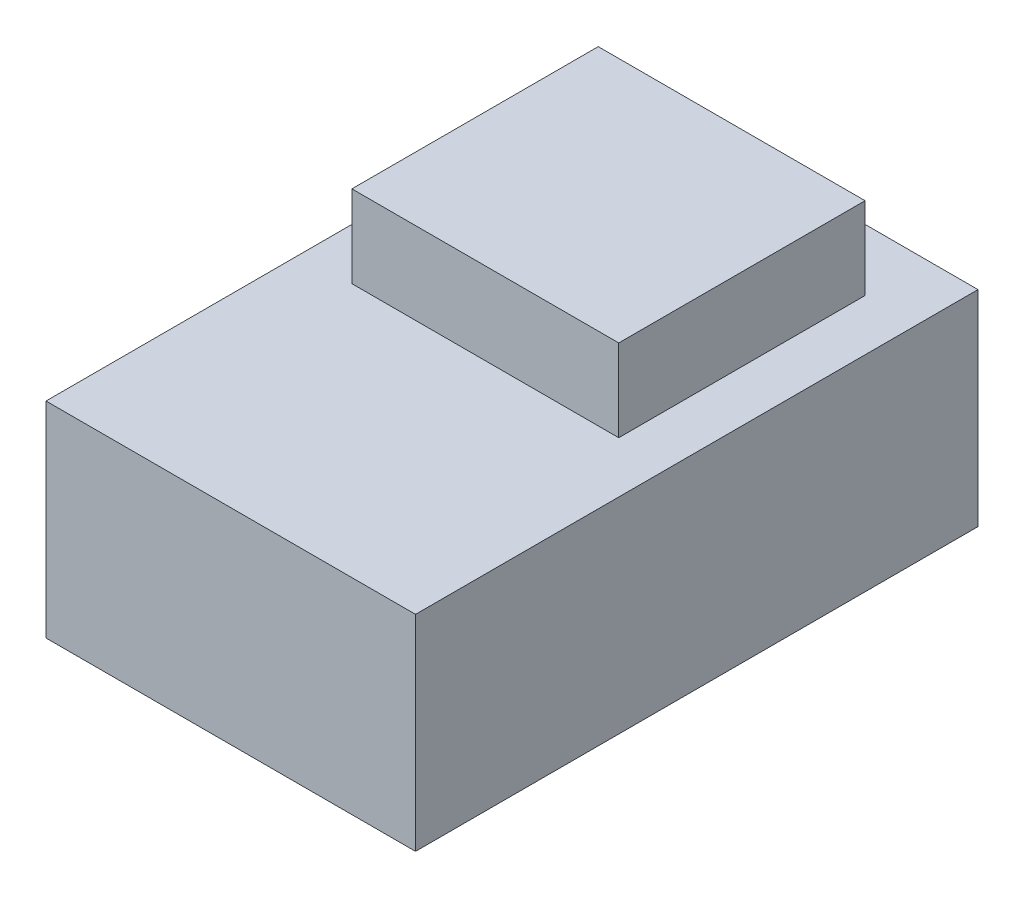
ISO-10303-21;
HEADER;
FILE_DESCRIPTION(('STEP AP214'),'2;1');
FILE_NAME('part.step','',(''),(''),'','','');
FILE_SCHEMA(('AUTOMOTIVE_DESIGN { 1 0 10303 214 1 1 1 1 }'));
ENDSEC;
DATA;
#1=APPLICATION_CONTEXT('core data for automotive mechanical design processes');
#2=APPLICATION_PROTOCOL_DEFINITION('international standard','automotive_design',2000,#1);
#3=PRODUCT_CONTEXT('',#1,'mechanical');
#4=PRODUCT('Part','Part','',(#3));
#5=PRODUCT_RELATED_PRODUCT_CATEGORY('part','',(#4));
#6=PRODUCT_DEFINITION_FORMATION('','',#4);
#7=PRODUCT_DEFINITION_CONTEXT('part definition',#1,'design');
#8=PRODUCT_DEFINITION('design','',#6,#7);
#9=PRODUCT_DEFINITION_SHAPE('','',#8);
#10=(LENGTH_UNIT() NAMED_UNIT(*) SI_UNIT(.MILLI.,.METRE.));
#11=(NAMED_UNIT(*) PLANE_ANGLE_UNIT() SI_UNIT($,.RADIAN.));
#12=(NAMED_UNIT(*) SI_UNIT($,.STERADIAN.) SOLID_ANGLE_UNIT());
#13=UNCERTAINTY_MEASURE_WITH_UNIT(LENGTH_MEASURE(1.E-05),#10,'distance_accuracy_value','');
#14=(GEOMETRIC_REPRESENTATION_CONTEXT(3) GLOBAL_UNCERTAINTY_ASSIGNED_CONTEXT((#13)) GLOBAL_UNIT_ASSIGNED_CONTEXT((#10,
#11,#12)) REPRESENTATION_CONTEXT('',''));
#15=CARTESIAN_POINT('',(0.,0.,0.));
#16=DIRECTION('',(0.,0.,1.));
#17=DIRECTION('',(1.,0.,0.));
#18=AXIS2_PLACEMENT_3D('',#15,#16,#17);
#19=CARTESIAN_POINT('',(-45.,25.,137.));
#20=DIRECTION('',(0.,-1.,0.));
#21=DIRECTION('',(0.,0.,-1.));
#22=AXIS2_PLACEMENT_3D('',#19,#20,#21);
#23=PLANE('',#22);
#24=DIRECTION('',(-1.,0.,0.));
#25=VECTOR('',#24,1.);
#26=CARTESIAN_POINT('',(-45.,25.,0.));
#27=LINE('',#26,#25);
#28=CARTESIAN_POINT('',(45.,25.,0.));
#29=VERTEX_POINT('',#28);
#30=CARTESIAN_POINT('',(-45.,25.,0.));
#31=VERTEX_POINT('',#30);
#32=EDGE_CURVE('E127',#29,#31,#27,.T.);
#33=ORIENTED_EDGE('',*,*,#32,.T.);
#34=DIRECTION('',(0.,0.,-1.));
#35=VECTOR('',#34,1.);
#36=CARTESIAN_POINT('',(-45.,25.,137.));
#37=LINE('',#36,#35);
#38=CARTESIAN_POINT('',(-45.,25.,137.));
#39=VERTEX_POINT('',#38);
#40=EDGE_CURVE('E47',#39,#31,#37,.T.);
#41=ORIENTED_EDGE('',*,*,#40,.F.);
#42=DIRECTION('',(-1.,0.,0.));
#43=VECTOR('',#42,1.);
#44=CARTESIAN_POINT('',(-45.,25.,137.));
#45=LINE('',#44,#43);
#46=CARTESIAN_POINT('',(45.,25.,137.));
#47=VERTEX_POINT('',#46);
#48=EDGE_CURVE('E136',#47,#39,#45,.T.);
#49=ORIENTED_EDGE('',*,*,#48,.F.);
#50=DIRECTION('',(0.,0.,-1.));
#51=VECTOR('',#50,1.);
#52=CARTESIAN_POINT('',(45.,25.,137.));
#53=LINE('',#52,#51);
#54=EDGE_CURVE('E11',#47,#29,#53,.T.);
#55=ORIENTED_EDGE('',*,*,#54,.T.);
#56=EDGE_LOOP('',(#33,#41,#49,#55));
#57=FACE_BOUND('',#56,.T.);
#58=DIRECTION('',(0.,0.,-1.));
#59=VECTOR('',#58,1.);
#60=CARTESIAN_POINT('',(32.5,25.,15.));
#61=LINE('',#60,#59);
#62=CARTESIAN_POINT('',(32.5,25.,75.));
#63=VERTEX_POINT('',#62);
#64=CARTESIAN_POINT('',(32.5,25.,15.));
#65=VERTEX_POINT('',#64);
#66=EDGE_CURVE('E54',#63,#65,#61,.T.);
#67=ORIENTED_EDGE('',*,*,#66,.F.);
#68=DIRECTION('',(1.,0.,0.));
#69=VECTOR('',#68,1.);
#70=CARTESIAN_POINT('',(-32.5,25.,75.));
#71=LINE('',#70,#69);
#72=CARTESIAN_POINT('',(-32.5,25.,75.));
#73=VERTEX_POINT('',#72);
#74=EDGE_CURVE('E58',#73,#63,#71,.T.);
#75=ORIENTED_EDGE('',*,*,#74,.F.);
#76=DIRECTION('',(0.,0.,1.));
#77=VECTOR('',#76,1.);
#78=CARTESIAN_POINT('',(-32.5,25.,15.));
#79=LINE('',#78,#77);
#80=CARTESIAN_POINT('',(-32.5,25.,15.));
#81=VERTEX_POINT('',#80);
#82=EDGE_CURVE('E266',#81,#73,#79,.T.);
#83=ORIENTED_EDGE('',*,*,#82,.F.);
#84=DIRECTION('',(-1.,0.,0.));
#85=VECTOR('',#84,1.);
#86=CARTESIAN_POINT('',(-32.5,25.,15.));
#87=LINE('',#86,#85);
#88=EDGE_CURVE('E272',#65,#81,#87,.T.);
#89=ORIENTED_EDGE('',*,*,#88,.F.);
#90=EDGE_LOOP('',(#67,#75,#83,#89));
#91=FACE_BOUND('',#90,.T.);
#92=ADVANCED_FACE('F39',(#57,#91),#23,.F.);
#93=CARTESIAN_POINT('',(45.,-25.,137.));
#94=DIRECTION('',(-1.,0.,0.));
#95=DIRECTION('',(0.,0.,1.));
#96=AXIS2_PLACEMENT_3D('',#93,#94,#95);
#97=PLANE('',#96);
#98=DIRECTION('',(0.,1.,0.));
#99=VECTOR('',#98,1.);
#100=CARTESIAN_POINT('',(45.,-25.,0.));
#101=LINE('',#100,#99);
#102=CARTESIAN_POINT('',(45.,-25.,0.));
#103=VERTEX_POINT('',#102);
#104=EDGE_CURVE('E124',#103,#29,#101,.T.);
#105=ORIENTED_EDGE('',*,*,#104,.T.);
#106=ORIENTED_EDGE('',*,*,#54,.F.);
#107=DIRECTION('',(0.,1.,0.));
#108=VECTOR('',#107,1.);
#109=CARTESIAN_POINT('',(45.,-25.,137.));
#110=LINE('',#109,#108);
#111=CARTESIAN_POINT('',(45.,-25.,137.));
#112=VERTEX_POINT('',#111);
#113=EDGE_CURVE('E133',#112,#47,#110,.T.);
#114=ORIENTED_EDGE('',*,*,#113,.F.);
#115=DIRECTION('',(0.,0.,-1.));
#116=VECTOR('',#115,1.);
#117=CARTESIAN_POINT('',(45.,-25.,137.));
#118=LINE('',#117,#116);
#119=EDGE_CURVE('E142',#112,#103,#118,.T.);
#120=ORIENTED_EDGE('',*,*,#119,.T.);
#121=EDGE_LOOP('',(#105,#106,#114,#120));
#122=FACE_BOUND('',#121,.T.);
#123=ADVANCED_FACE('F41',(#122),#97,.F.);
#124=CARTESIAN_POINT('',(-45.,-25.,137.));
#125=DIRECTION('',(1.,0.,0.));
#126=DIRECTION('',(0.,0.,-1.));
#127=AXIS2_PLACEMENT_3D('',#124,#125,#126);
#128=PLANE('',#127);
#129=DIRECTION('',(0.,-1.,0.));
#130=VECTOR('',#129,1.);
#131=CARTESIAN_POINT('',(-45.,-25.,0.));
#132=LINE('',#131,#130);
#133=CARTESIAN_POINT('',(-45.,-25.,0.));
#134=VERTEX_POINT('',#133);
#135=EDGE_CURVE('E145',#31,#134,#132,.T.);
#136=ORIENTED_EDGE('',*,*,#135,.T.);
#137=DIRECTION('',(0.,0.,-1.));
#138=VECTOR('',#137,1.);
#139=CARTESIAN_POINT('',(-45.,-25.,137.));
#140=LINE('',#139,#138);
#141=CARTESIAN_POINT('',(-45.,-25.,137.));
#142=VERTEX_POINT('',#141);
#143=EDGE_CURVE('E150',#142,#134,#140,.T.);
#144=ORIENTED_EDGE('',*,*,#143,.F.);
#145=DIRECTION('',(0.,-1.,0.));
#146=VECTOR('',#145,1.);
#147=CARTESIAN_POINT('',(-45.,-25.,137.));
#148=LINE('',#147,#146);
#149=EDGE_CURVE('E139',#39,#142,#148,.T.);
#150=ORIENTED_EDGE('',*,*,#149,.F.);
#151=ORIENTED_EDGE('',*,*,#40,.T.);
#152=EDGE_LOOP('',(#136,#144,#150,#151));
#153=FACE_BOUND('',#152,.T.);
#154=ADVANCED_FACE('F157',(#153),#128,.F.);
#155=CARTESIAN_POINT('',(-45.,-25.,137.));
#156=DIRECTION('',(0.,1.,0.));
#157=DIRECTION('',(0.,0.,1.));
#158=AXIS2_PLACEMENT_3D('',#155,#156,#157);
#159=PLANE('',#158);
#160=DIRECTION('',(1.,0.,0.));
#161=VECTOR('',#160,1.);
#162=CARTESIAN_POINT('',(-45.,-25.,0.));
#163=LINE('',#162,#161);
#164=EDGE_CURVE('E137',#134,#103,#163,.T.);
#165=ORIENTED_EDGE('',*,*,#164,.T.);
#166=ORIENTED_EDGE('',*,*,#119,.F.);
#167=DIRECTION('',(1.,0.,0.));
#168=VECTOR('',#167,1.);
#169=CARTESIAN_POINT('',(-45.,-25.,137.));
#170=LINE('',#169,#168);
#171=EDGE_CURVE('E141',#142,#112,#170,.T.);
#172=ORIENTED_EDGE('',*,*,#171,.F.);
#173=ORIENTED_EDGE('',*,*,#143,.T.);
#174=EDGE_LOOP('',(#165,#166,#172,#173));
#175=FACE_BOUND('',#174,.T.);
#176=ADVANCED_FACE('F166',(#175),#159,.F.);
#177=CARTESIAN_POINT('',(0.,0.,137.));
#178=DIRECTION('',(0.,0.,-1.));
#179=DIRECTION('',(-1.,0.,0.));
#180=AXIS2_PLACEMENT_3D('',#177,#178,#179);
#181=PLANE('',#180);
#182=ORIENTED_EDGE('',*,*,#113,.T.);
#183=ORIENTED_EDGE('',*,*,#48,.T.);
#184=ORIENTED_EDGE('',*,*,#149,.T.);
#185=ORIENTED_EDGE('',*,*,#171,.T.);
#186=EDGE_LOOP('',(#182,#183,#184,#185));
#187=FACE_BOUND('',#186,.T.);
#188=ADVANCED_FACE('F172',(#187),#181,.F.);
#189=CARTESIAN_POINT('',(0.,0.,0.));
#190=DIRECTION('',(0.,0.,-1.));
#191=DIRECTION('',(-1.,0.,0.));
#192=AXIS2_PLACEMENT_3D('',#189,#190,#191);
#193=PLANE('',#192);
#194=ORIENTED_EDGE('',*,*,#104,.F.);
#195=ORIENTED_EDGE('',*,*,#164,.F.);
#196=ORIENTED_EDGE('',*,*,#135,.F.);
#197=ORIENTED_EDGE('',*,*,#32,.F.);
#198=EDGE_LOOP('',(#194,#195,#196,#197));
#199=FACE_BOUND('',#198,.T.);
#200=ADVANCED_FACE('F163',(#199),#193,.T.);
#201=CARTESIAN_POINT('',(32.5,45.,15.));
#202=DIRECTION('',(-1.,0.,0.));
#203=DIRECTION('',(0.,0.,1.));
#204=AXIS2_PLACEMENT_3D('',#201,#202,#203);
#205=PLANE('',#204);
#206=ORIENTED_EDGE('',*,*,#66,.T.);
#207=DIRECTION('',(0.,-1.,0.));
#208=VECTOR('',#207,1.);
#209=CARTESIAN_POINT('',(32.5,45.,15.));
#210=LINE('',#209,#208);
#211=CARTESIAN_POINT('',(32.5,45.,15.));
#212=VERTEX_POINT('',#211);
#213=EDGE_CURVE('E107',#212,#65,#210,.T.);
#214=ORIENTED_EDGE('',*,*,#213,.F.);
#215=DIRECTION('',(0.,0.,-1.));
#216=VECTOR('',#215,1.);
#217=CARTESIAN_POINT('',(32.5,45.,15.));
#218=LINE('',#217,#216);
#219=CARTESIAN_POINT('',(32.5,45.,75.));
#220=VERTEX_POINT('',#219);
#221=EDGE_CURVE('E113',#220,#212,#218,.T.);
#222=ORIENTED_EDGE('',*,*,#221,.F.);
#223=DIRECTION('',(0.,-1.,0.));
#224=VECTOR('',#223,1.);
#225=CARTESIAN_POINT('',(32.5,45.,75.));
#226=LINE('',#225,#224);
#227=EDGE_CURVE('E264',#220,#63,#226,.T.);
#228=ORIENTED_EDGE('',*,*,#227,.T.);
#229=EDGE_LOOP('',(#206,#214,#222,#228));
#230=FACE_BOUND('',#229,.T.);
#231=ADVANCED_FACE('F123',(#230),#205,.F.);
#232=CARTESIAN_POINT('',(-32.5,45.,15.));
#233=DIRECTION('',(0.,0.,1.));
#234=DIRECTION('',(1.,0.,0.));
#235=AXIS2_PLACEMENT_3D('',#232,#233,#234);
#236=PLANE('',#235);
#237=ORIENTED_EDGE('',*,*,#88,.T.);
#238=DIRECTION('',(0.,-1.,0.));
#239=VECTOR('',#238,1.);
#240=CARTESIAN_POINT('',(-32.5,45.,15.));
#241=LINE('',#240,#239);
#242=CARTESIAN_POINT('',(-32.5,45.,15.));
#243=VERTEX_POINT('',#242);
#244=EDGE_CURVE('E109',#243,#81,#241,.T.);
#245=ORIENTED_EDGE('',*,*,#244,.F.);
#246=DIRECTION('',(-1.,0.,0.));
#247=VECTOR('',#246,1.);
#248=CARTESIAN_POINT('',(-32.5,45.,15.));
#249=LINE('',#248,#247);
#250=EDGE_CURVE('E102',#212,#243,#249,.T.);
#251=ORIENTED_EDGE('',*,*,#250,.F.);
#252=ORIENTED_EDGE('',*,*,#213,.T.);
#253=EDGE_LOOP('',(#237,#245,#251,#252));
#254=FACE_BOUND('',#253,.T.);
#255=ADVANCED_FACE('F105',(#254),#236,.F.);
#256=CARTESIAN_POINT('',(-32.5,45.,15.));
#257=DIRECTION('',(1.,0.,0.));
#258=DIRECTION('',(0.,0.,-1.));
#259=AXIS2_PLACEMENT_3D('',#256,#257,#258);
#260=PLANE('',#259);
#261=ORIENTED_EDGE('',*,*,#82,.T.);
#262=DIRECTION('',(0.,-1.,0.));
#263=VECTOR('',#262,1.);
#264=CARTESIAN_POINT('',(-32.5,45.,75.));
#265=LINE('',#264,#263);
#266=CARTESIAN_POINT('',(-32.5,45.,75.));
#267=VERTEX_POINT('',#266);
#268=EDGE_CURVE('E129',#267,#73,#265,.T.);
#269=ORIENTED_EDGE('',*,*,#268,.F.);
#270=DIRECTION('',(0.,0.,1.));
#271=VECTOR('',#270,1.);
#272=CARTESIAN_POINT('',(-32.5,45.,15.));
#273=LINE('',#272,#271);
#274=EDGE_CURVE('E112',#243,#267,#273,.T.);
#275=ORIENTED_EDGE('',*,*,#274,.F.);
#276=ORIENTED_EDGE('',*,*,#244,.T.);
#277=EDGE_LOOP('',(#261,#269,#275,#276));
#278=FACE_BOUND('',#277,.T.);
#279=ADVANCED_FACE('F190',(#278),#260,.F.);
#280=CARTESIAN_POINT('',(-32.5,45.,75.));
#281=DIRECTION('',(0.,0.,-1.));
#282=DIRECTION('',(-1.,0.,0.));
#283=AXIS2_PLACEMENT_3D('',#280,#281,#282);
#284=PLANE('',#283);
#285=ORIENTED_EDGE('',*,*,#74,.T.);
#286=ORIENTED_EDGE('',*,*,#227,.F.);
#287=DIRECTION('',(1.,0.,0.));
#288=VECTOR('',#287,1.);
#289=CARTESIAN_POINT('',(-32.5,45.,75.));
#290=LINE('',#289,#288);
#291=EDGE_CURVE('E118',#267,#220,#290,.T.);
#292=ORIENTED_EDGE('',*,*,#291,.F.);
#293=ORIENTED_EDGE('',*,*,#268,.T.);
#294=EDGE_LOOP('',(#285,#286,#292,#293));
#295=FACE_BOUND('',#294,.T.);
#296=ADVANCED_FACE('F193',(#295),#284,.F.);
#297=CARTESIAN_POINT('',(0.,45.,0.));
#298=DIRECTION('',(0.,1.,0.));
#299=DIRECTION('',(0.,0.,1.));
#300=AXIS2_PLACEMENT_3D('',#297,#298,#299);
#301=PLANE('',#300);
#302=ORIENTED_EDGE('',*,*,#221,.T.);
#303=ORIENTED_EDGE('',*,*,#250,.T.);
#304=ORIENTED_EDGE('',*,*,#274,.T.);
#305=ORIENTED_EDGE('',*,*,#291,.T.);
#306=EDGE_LOOP('',(#302,#303,#304,#305));
#307=FACE_BOUND('',#306,.T.);
#308=ADVANCED_FACE('F116',(#307),#301,.T.);
#309=CLOSED_SHELL('',(#92,#123,#154,#176,#188,#200,#231,#255,#279,#296,#308));
#310=MANIFOLD_SOLID_BREP('B2',#309);
#311=ADVANCED_BREP_SHAPE_REPRESENTATION('',(#18,#310),#14);
#312=SHAPE_DEFINITION_REPRESENTATION(#9,#311);
ENDSEC;
END-ISO-10303-21;
